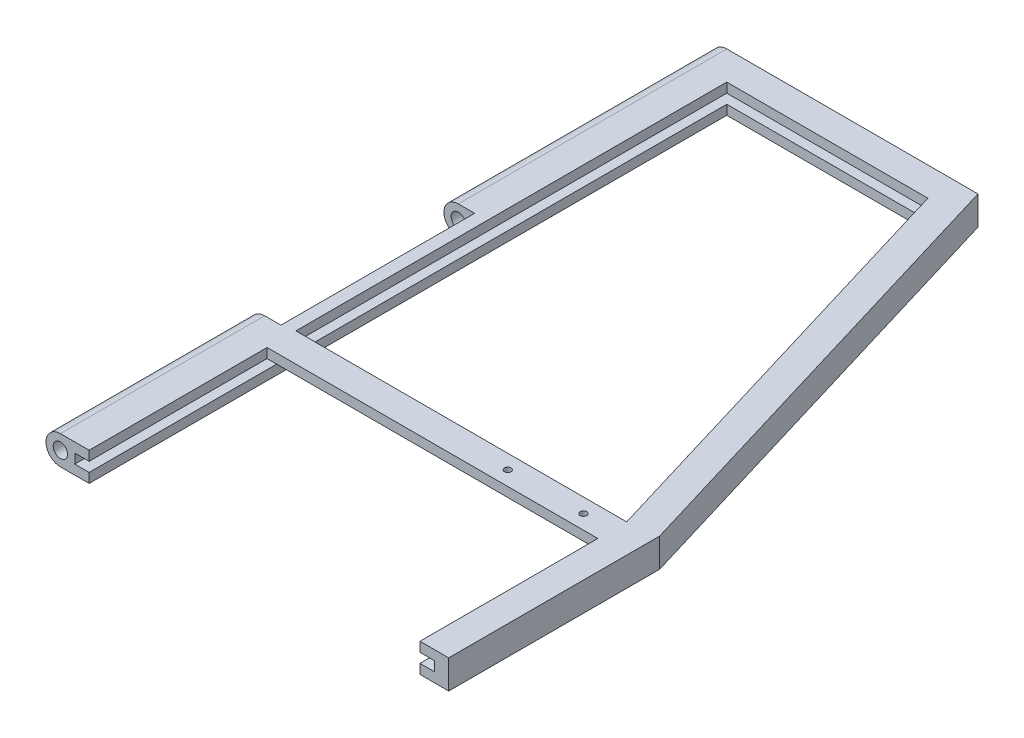
ISO-10303-21;
HEADER;
FILE_DESCRIPTION(('STEP AP214'),'2;1');
FILE_NAME('part.step','',(''),(''),'','','');
FILE_SCHEMA(('AUTOMOTIVE_DESIGN { 1 0 10303 214 1 1 1 1 }'));
ENDSEC;
DATA;
#1=APPLICATION_CONTEXT('core data for automotive mechanical design processes');
#2=APPLICATION_PROTOCOL_DEFINITION('international standard','automotive_design',2000,#1);
#3=PRODUCT_CONTEXT('',#1,'mechanical');
#4=PRODUCT('Part','Part','',(#3));
#5=PRODUCT_RELATED_PRODUCT_CATEGORY('part','',(#4));
#6=PRODUCT_DEFINITION_FORMATION('','',#4);
#7=PRODUCT_DEFINITION_CONTEXT('part definition',#1,'design');
#8=PRODUCT_DEFINITION('design','',#6,#7);
#9=PRODUCT_DEFINITION_SHAPE('','',#8);
#10=(LENGTH_UNIT() NAMED_UNIT(*) SI_UNIT(.MILLI.,.METRE.));
#11=(NAMED_UNIT(*) PLANE_ANGLE_UNIT() SI_UNIT($,.RADIAN.));
#12=(NAMED_UNIT(*) SI_UNIT($,.STERADIAN.) SOLID_ANGLE_UNIT());
#13=UNCERTAINTY_MEASURE_WITH_UNIT(LENGTH_MEASURE(1.E-05),#10,'distance_accuracy_value','');
#14=(GEOMETRIC_REPRESENTATION_CONTEXT(3) GLOBAL_UNCERTAINTY_ASSIGNED_CONTEXT((#13)) GLOBAL_UNIT_ASSIGNED_CONTEXT((#10,
#11,#12)) REPRESENTATION_CONTEXT('',''));
#15=CARTESIAN_POINT('',(0.,0.,0.));
#16=DIRECTION('',(0.,0.,1.));
#17=DIRECTION('',(1.,0.,0.));
#18=AXIS2_PLACEMENT_3D('',#15,#16,#17);
#19=CARTESIAN_POINT('',(0.,0.,3.));
#20=DIRECTION('',(0.,0.,1.));
#21=DIRECTION('',(1.,0.,0.));
#22=AXIS2_PLACEMENT_3D('',#19,#20,#21);
#23=PLANE('',#22);
#24=DIRECTION('',(-1.,0.,0.));
#25=VECTOR('',#24,1.);
#26=CARTESIAN_POINT('',(-0.199999999999998,1.99999999999999,3.));
#27=LINE('',#26,#25);
#28=CARTESIAN_POINT('',(22.2701570676023,1.99999999999999,3.));
#29=VERTEX_POINT('',#28);
#30=CARTESIAN_POINT('',(1.3,2.,3.));
#31=VERTEX_POINT('',#30);
#32=EDGE_CURVE('E289',#29,#31,#27,.T.);
#33=ORIENTED_EDGE('',*,*,#32,.F.);
#34=DIRECTION('',(0.,1.,0.));
#35=VECTOR('',#34,1.);
#36=CARTESIAN_POINT('',(22.2701570676023,0.,3.));
#37=LINE('',#36,#35);
#38=CARTESIAN_POINT('',(22.2701570676023,3.,3.));
#39=VERTEX_POINT('',#38);
#40=EDGE_CURVE('E421',#29,#39,#37,.T.);
#41=ORIENTED_EDGE('',*,*,#40,.T.);
#42=DIRECTION('',(1.,0.,0.));
#43=VECTOR('',#42,1.);
#44=CARTESIAN_POINT('',(0.,3.,3.));
#45=LINE('',#44,#43);
#46=CARTESIAN_POINT('',(1.3,3.,3.));
#47=VERTEX_POINT('',#46);
#48=EDGE_CURVE('E425',#47,#39,#45,.T.);
#49=ORIENTED_EDGE('',*,*,#48,.F.);
#50=DIRECTION('',(0.,1.,0.));
#51=VECTOR('',#50,1.);
#52=CARTESIAN_POINT('',(1.3,0.,3.));
#53=LINE('',#52,#51);
#54=EDGE_CURVE('E393',#31,#47,#53,.T.);
#55=ORIENTED_EDGE('',*,*,#54,.F.);
#56=EDGE_LOOP('',(#33,#41,#49,#55));
#57=FACE_BOUND('',#56,.T.);
#58=ADVANCED_FACE('F45',(#57),#23,.T.);
#59=CARTESIAN_POINT('',(1.3,0.,0.));
#60=DIRECTION('',(1.,0.,0.));
#61=DIRECTION('',(0.,0.,-1.));
#62=AXIS2_PLACEMENT_3D('',#59,#60,#61);
#63=PLANE('',#62);
#64=DIRECTION('',(0.,0.,-1.));
#65=VECTOR('',#64,1.);
#66=CARTESIAN_POINT('',(1.3,2.,0.));
#67=LINE('',#66,#65);
#68=CARTESIAN_POINT('',(1.3,1.99999999999999,69.5));
#69=VERTEX_POINT('',#68);
#70=CARTESIAN_POINT('',(1.3,1.99999999999999,50.9417859642579));
#71=VERTEX_POINT('',#70);
#72=EDGE_CURVE('E379',#69,#71,#67,.T.);
#73=ORIENTED_EDGE('',*,*,#72,.T.);
#74=DIRECTION('',(0.,-1.,0.));
#75=VECTOR('',#74,1.);
#76=CARTESIAN_POINT('',(1.3,3.,50.9417859642579));
#77=LINE('',#76,#75);
#78=CARTESIAN_POINT('',(1.3,3.,50.9417859642579));
#79=VERTEX_POINT('',#78);
#80=EDGE_CURVE('E307',#79,#71,#77,.T.);
#81=ORIENTED_EDGE('',*,*,#80,.F.);
#82=DIRECTION('',(0.,0.,-1.));
#83=VECTOR('',#82,1.);
#84=CARTESIAN_POINT('',(1.3,3.,0.));
#85=LINE('',#84,#83);
#86=CARTESIAN_POINT('',(1.3,3.,69.5));
#87=VERTEX_POINT('',#86);
#88=EDGE_CURVE('E397',#87,#79,#85,.T.);
#89=ORIENTED_EDGE('',*,*,#88,.F.);
#90=DIRECTION('',(0.,1.,0.));
#91=VECTOR('',#90,1.);
#92=CARTESIAN_POINT('',(1.3,0.,69.5));
#93=LINE('',#92,#91);
#94=EDGE_CURVE('E409',#69,#87,#93,.T.);
#95=ORIENTED_EDGE('',*,*,#94,.F.);
#96=EDGE_LOOP('',(#73,#81,#89,#95));
#97=FACE_BOUND('',#96,.T.);
#98=ADVANCED_FACE('F612',(#97),#63,.T.);
#99=CARTESIAN_POINT('',(1.3,3.,47.9417859642579));
#100=VERTEX_POINT('',#99);
#101=EDGE_CURVE('E70',#100,#47,#85,.T.);
#102=ORIENTED_EDGE('',*,*,#101,.F.);
#103=DIRECTION('',(0.,1.,0.));
#104=VECTOR('',#103,1.);
#105=CARTESIAN_POINT('',(1.3,3.,47.9417859642579));
#106=LINE('',#105,#104);
#107=CARTESIAN_POINT('',(1.3,1.99999999999999,47.9417859642579));
#108=VERTEX_POINT('',#107);
#109=EDGE_CURVE('E310',#108,#100,#106,.T.);
#110=ORIENTED_EDGE('',*,*,#109,.F.);
#111=EDGE_CURVE('E375',#108,#31,#67,.T.);
#112=ORIENTED_EDGE('',*,*,#111,.T.);
#113=ORIENTED_EDGE('',*,*,#54,.T.);
#114=EDGE_LOOP('',(#102,#110,#112,#113));
#115=FACE_BOUND('',#114,.T.);
#116=ADVANCED_FACE('F660',(#115),#63,.T.);
#117=CARTESIAN_POINT('',(35.8,0.,0.));
#118=DIRECTION('',(-1.,0.,0.));
#119=DIRECTION('',(0.,0.,1.));
#120=AXIS2_PLACEMENT_3D('',#117,#118,#119);
#121=PLANE('',#120);
#122=DIRECTION('',(0.,0.,1.));
#123=VECTOR('',#122,1.);
#124=CARTESIAN_POINT('',(35.8,3.,0.));
#125=LINE('',#124,#123);
#126=CARTESIAN_POINT('',(35.8,3.,50.9417859642579));
#127=VERTEX_POINT('',#126);
#128=CARTESIAN_POINT('',(35.8,3.,69.5));
#129=VERTEX_POINT('',#128);
#130=EDGE_CURVE('E62',#127,#129,#125,.T.);
#131=ORIENTED_EDGE('',*,*,#130,.F.);
#132=DIRECTION('',(0.,1.,0.));
#133=VECTOR('',#132,1.);
#134=CARTESIAN_POINT('',(35.8,3.,50.9417859642579));
#135=LINE('',#134,#133);
#136=CARTESIAN_POINT('',(35.8,1.99999999999999,50.9417859642579));
#137=VERTEX_POINT('',#136);
#138=EDGE_CURVE('E314',#137,#127,#135,.T.);
#139=ORIENTED_EDGE('',*,*,#138,.F.);
#140=DIRECTION('',(0.,0.,1.));
#141=VECTOR('',#140,1.);
#142=CARTESIAN_POINT('',(35.8,2.,0.));
#143=LINE('',#142,#141);
#144=CARTESIAN_POINT('',(35.8,1.99999999999999,69.5));
#145=VERTEX_POINT('',#144);
#146=EDGE_CURVE('E359',#137,#145,#143,.T.);
#147=ORIENTED_EDGE('',*,*,#146,.T.);
#148=DIRECTION('',(0.,1.,0.));
#149=VECTOR('',#148,1.);
#150=CARTESIAN_POINT('',(35.8,0.,69.5));
#151=LINE('',#150,#149);
#152=EDGE_CURVE('E413',#145,#129,#151,.T.);
#153=ORIENTED_EDGE('',*,*,#152,.T.);
#154=EDGE_LOOP('',(#131,#139,#147,#153));
#155=FACE_BOUND('',#154,.T.);
#156=ADVANCED_FACE('F604',(#155),#121,.T.);
#157=CARTESIAN_POINT('',(0.,0.,48.2));
#158=DIRECTION('',(0.,0.,-1.));
#159=DIRECTION('',(-1.,0.,0.));
#160=AXIS2_PLACEMENT_3D('',#157,#158,#159);
#161=PLANE('',#160);
#162=CARTESIAN_POINT('',(-1.7,1.5,48.2));
#163=DIRECTION('',(0.,0.,-1.));
#164=DIRECTION('',(-1.,0.,0.));
#165=AXIS2_PLACEMENT_3D('',#162,#163,#164);
#166=CIRCLE('',#165,0.75);
#167=CARTESIAN_POINT('',(-2.45,1.5,48.2));
#168=VERTEX_POINT('',#167);
#169=EDGE_CURVE('E471',#168,#168,#166,.F.);
#170=ORIENTED_EDGE('',*,*,#169,.T.);
#171=EDGE_LOOP('',(#170));
#172=FACE_BOUND('',#171,.T.);
#173=DIRECTION('',(0.,1.,0.));
#174=VECTOR('',#173,1.);
#175=CARTESIAN_POINT('',(0.,0.,48.2));
#176=LINE('',#175,#174);
#177=CARTESIAN_POINT('',(0.,1.99999999999999,48.2));
#178=VERTEX_POINT('',#177);
#179=CARTESIAN_POINT('',(0.,3.,48.2));
#180=VERTEX_POINT('',#179);
#181=EDGE_CURVE('E452',#178,#180,#176,.T.);
#182=ORIENTED_EDGE('',*,*,#181,.F.);
#183=DIRECTION('',(-1.,0.,0.));
#184=VECTOR('',#183,1.);
#185=CARTESIAN_POINT('',(0.,1.99999999999999,48.2));
#186=LINE('',#185,#184);
#187=CARTESIAN_POINT('',(-0.199999999999999,1.99999999999999,48.2));
#188=VERTEX_POINT('',#187);
#189=EDGE_CURVE('E361',#178,#188,#186,.T.);
#190=ORIENTED_EDGE('',*,*,#189,.T.);
#191=DIRECTION('',(0.,-1.,0.));
#192=VECTOR('',#191,1.);
#193=CARTESIAN_POINT('',(-0.199999999999999,0.,48.2));
#194=LINE('',#193,#192);
#195=CARTESIAN_POINT('',(-0.199999999999999,0.999999999999994,48.2));
#196=VERTEX_POINT('',#195);
#197=EDGE_CURVE('E364',#188,#196,#194,.T.);
#198=ORIENTED_EDGE('',*,*,#197,.T.);
#199=DIRECTION('',(-1.,0.,0.));
#200=VECTOR('',#199,1.);
#201=CARTESIAN_POINT('',(0.,0.999999999999994,48.2));
#202=LINE('',#201,#200);
#203=CARTESIAN_POINT('',(0.,0.999999999999994,48.2));
#204=VERTEX_POINT('',#203);
#205=EDGE_CURVE('E357',#204,#196,#202,.T.);
#206=ORIENTED_EDGE('',*,*,#205,.F.);
#207=CARTESIAN_POINT('',(0.,0.,48.2));
#208=VERTEX_POINT('',#207);
#209=EDGE_CURVE('E461',#208,#204,#176,.T.);
#210=ORIENTED_EDGE('',*,*,#209,.F.);
#211=DIRECTION('',(-1.,0.,0.));
#212=VECTOR('',#211,1.);
#213=CARTESIAN_POINT('',(0.,0.,48.2));
#214=LINE('',#213,#212);
#215=CARTESIAN_POINT('',(-1.7,0.,48.2));
#216=VERTEX_POINT('',#215);
#217=EDGE_CURVE('E442',#208,#216,#214,.T.);
#218=ORIENTED_EDGE('',*,*,#217,.T.);
#219=CARTESIAN_POINT('',(-1.7,1.5,48.2));
#220=DIRECTION('',(0.,0.,-1.));
#221=DIRECTION('',(-1.,0.,0.));
#222=AXIS2_PLACEMENT_3D('',#219,#220,#221);
#223=CIRCLE('',#222,1.5);
#224=CARTESIAN_POINT('',(-1.7,3.,48.2));
#225=VERTEX_POINT('',#224);
#226=EDGE_CURVE('E472',#225,#216,#223,.F.);
#227=ORIENTED_EDGE('',*,*,#226,.F.);
#228=DIRECTION('',(-1.,0.,0.));
#229=VECTOR('',#228,1.);
#230=CARTESIAN_POINT('',(0.,3.,48.2));
#231=LINE('',#230,#229);
#232=EDGE_CURVE('E453',#180,#225,#231,.T.);
#233=ORIENTED_EDGE('',*,*,#232,.F.);
#234=EDGE_LOOP('',(#182,#190,#198,#206,#210,#218,#227,#233));
#235=FACE_BOUND('',#234,.T.);
#236=ADVANCED_FACE('F547',(#172,#235),#161,.T.);
#237=CARTESIAN_POINT('',(0.,0.,48.2));
#238=DIRECTION('',(1.,0.,0.));
#239=DIRECTION('',(0.,0.,-1.));
#240=AXIS2_PLACEMENT_3D('',#237,#238,#239);
#241=PLANE('',#240);
#242=DIRECTION('',(0.,0.,-1.));
#243=VECTOR('',#242,1.);
#244=CARTESIAN_POINT('',(0.,1.99999999999999,48.2));
#245=LINE('',#244,#243);
#246=CARTESIAN_POINT('',(0.,2.,28.));
#247=VERTEX_POINT('',#246);
#248=EDGE_CURVE('E381',#178,#247,#245,.T.);
#249=ORIENTED_EDGE('',*,*,#248,.F.);
#250=ORIENTED_EDGE('',*,*,#181,.T.);
#251=DIRECTION('',(0.,0.,-1.));
#252=VECTOR('',#251,1.);
#253=CARTESIAN_POINT('',(0.,3.,48.2));
#254=LINE('',#253,#252);
#255=CARTESIAN_POINT('',(0.,3.,28.));
#256=VERTEX_POINT('',#255);
#257=EDGE_CURVE('E446',#180,#256,#254,.T.);
#258=ORIENTED_EDGE('',*,*,#257,.T.);
#259=DIRECTION('',(0.,1.,0.));
#260=VECTOR('',#259,1.);
#261=CARTESIAN_POINT('',(0.,0.,28.));
#262=LINE('',#261,#260);
#263=EDGE_CURVE('E464',#247,#256,#262,.T.);
#264=ORIENTED_EDGE('',*,*,#263,.F.);
#265=EDGE_LOOP('',(#249,#250,#258,#264));
#266=FACE_BOUND('',#265,.T.);
#267=ADVANCED_FACE('F627',(#266),#241,.F.);
#268=CARTESIAN_POINT('',(38.8,0.,69.5));
#269=DIRECTION('',(0.,0.,-1.));
#270=DIRECTION('',(-1.,0.,0.));
#271=AXIS2_PLACEMENT_3D('',#268,#269,#270);
#272=PLANE('',#271);
#273=CARTESIAN_POINT('',(-1.7,1.5,69.5));
#274=DIRECTION('',(0.,0.,-1.));
#275=DIRECTION('',(-1.,0.,0.));
#276=AXIS2_PLACEMENT_3D('',#273,#274,#275);
#277=CIRCLE('',#276,0.75);
#278=CARTESIAN_POINT('',(-2.45,1.5,69.5));
#279=VERTEX_POINT('',#278);
#280=EDGE_CURVE('E474',#279,#279,#277,.F.);
#281=ORIENTED_EDGE('',*,*,#280,.F.);
#282=EDGE_LOOP('',(#281));
#283=FACE_BOUND('',#282,.T.);
#284=DIRECTION('',(-1.,0.,0.));
#285=VECTOR('',#284,1.);
#286=CARTESIAN_POINT('',(60.8227155455453,1.99999999999999,69.5));
#287=LINE('',#286,#285);
#288=CARTESIAN_POINT('',(-0.199999999999998,1.99999999999999,69.5));
#289=VERTEX_POINT('',#288);
#290=EDGE_CURVE('E349',#69,#289,#287,.T.);
#291=ORIENTED_EDGE('',*,*,#290,.F.);
#292=ORIENTED_EDGE('',*,*,#94,.T.);
#293=DIRECTION('',(-1.,0.,0.));
#294=VECTOR('',#293,1.);
#295=CARTESIAN_POINT('',(38.8,3.,69.5));
#296=LINE('',#295,#294);
#297=CARTESIAN_POINT('',(-1.7,3.,69.5));
#298=VERTEX_POINT('',#297);
#299=EDGE_CURVE('E401',#87,#298,#296,.T.);
#300=ORIENTED_EDGE('',*,*,#299,.T.);
#301=CARTESIAN_POINT('',(-1.7,1.5,69.5));
#302=DIRECTION('',(0.,0.,-1.));
#303=DIRECTION('',(-1.,0.,0.));
#304=AXIS2_PLACEMENT_3D('',#301,#302,#303);
#305=CIRCLE('',#304,1.5);
#306=CARTESIAN_POINT('',(-1.7,0.,69.5));
#307=VERTEX_POINT('',#306);
#308=EDGE_CURVE('E475',#298,#307,#305,.F.);
#309=ORIENTED_EDGE('',*,*,#308,.T.);
#310=DIRECTION('',(-1.,0.,0.));
#311=VECTOR('',#310,1.);
#312=CARTESIAN_POINT('',(38.8,0.,69.5));
#313=LINE('',#312,#311);
#314=CARTESIAN_POINT('',(1.3,0.,69.5));
#315=VERTEX_POINT('',#314);
#316=EDGE_CURVE('E402',#315,#307,#313,.T.);
#317=ORIENTED_EDGE('',*,*,#316,.F.);
#318=CARTESIAN_POINT('',(1.3,0.999999999999995,69.5));
#319=VERTEX_POINT('',#318);
#320=EDGE_CURVE('E405',#315,#319,#93,.T.);
#321=ORIENTED_EDGE('',*,*,#320,.T.);
#322=DIRECTION('',(-1.,0.,0.));
#323=VECTOR('',#322,1.);
#324=CARTESIAN_POINT('',(60.8227155455453,0.999999999999995,69.5));
#325=LINE('',#324,#323);
#326=CARTESIAN_POINT('',(-0.199999999999998,0.999999999999995,69.5));
#327=VERTEX_POINT('',#326);
#328=EDGE_CURVE('E345',#319,#327,#325,.T.);
#329=ORIENTED_EDGE('',*,*,#328,.T.);
#330=DIRECTION('',(0.,-1.,0.));
#331=VECTOR('',#330,1.);
#332=CARTESIAN_POINT('',(-0.199999999999998,0.,69.5));
#333=LINE('',#332,#331);
#334=EDGE_CURVE('E338',#289,#327,#333,.T.);
#335=ORIENTED_EDGE('',*,*,#334,.F.);
#336=EDGE_LOOP('',(#291,#292,#300,#309,#317,#321,#329,#335));
#337=FACE_BOUND('',#336,.T.);
#338=ADVANCED_FACE('F558',(#283,#337),#272,.F.);
#339=CARTESIAN_POINT('',(19.5913797816014,0.,-5.89803643951368));
#340=DIRECTION('',(-0.957548422591337,0.,0.288272472485392));
#341=DIRECTION('',(0.288272472485393,0.,0.957548422591338));
#342=AXIS2_PLACEMENT_3D('',#339,#340,#341);
#343=PLANE('',#342);
#344=DIRECTION('',(0.288272472485393,0.,0.957548422591338));
#345=VECTOR('',#344,1.);
#346=CARTESIAN_POINT('',(19.5913797816014,2.,-5.89803643951368));
#347=LINE('',#346,#345);
#348=CARTESIAN_POINT('',(35.8,1.99999999999999,47.9417859642579));
#349=VERTEX_POINT('',#348);
#350=EDGE_CURVE('E509',#29,#349,#347,.T.);
#351=ORIENTED_EDGE('',*,*,#350,.T.);
#352=DIRECTION('',(0.,1.,0.));
#353=VECTOR('',#352,1.);
#354=CARTESIAN_POINT('',(35.8,0.,47.9417859642579));
#355=LINE('',#354,#353);
#356=CARTESIAN_POINT('',(35.8,3.,47.9417859642579));
#357=VERTEX_POINT('',#356);
#358=EDGE_CURVE('E417',#349,#357,#355,.T.);
#359=ORIENTED_EDGE('',*,*,#358,.T.);
#360=DIRECTION('',(0.288272472485393,0.,0.957548422591338));
#361=VECTOR('',#360,1.);
#362=CARTESIAN_POINT('',(19.5913797816014,3.,-5.89803643951368));
#363=LINE('',#362,#361);
#364=EDGE_CURVE('E428',#39,#357,#363,.T.);
#365=ORIENTED_EDGE('',*,*,#364,.F.);
#366=ORIENTED_EDGE('',*,*,#40,.F.);
#367=EDGE_LOOP('',(#351,#359,#365,#366));
#368=FACE_BOUND('',#367,.T.);
#369=ADVANCED_FACE('F669',(#368),#343,.T.);
#370=CARTESIAN_POINT('',(37.3,1.99999999999999,69.5));
#371=VERTEX_POINT('',#370);
#372=EDGE_CURVE('E350',#371,#145,#287,.T.);
#373=ORIENTED_EDGE('',*,*,#372,.F.);
#374=DIRECTION('',(0.,1.,0.));
#375=VECTOR('',#374,1.);
#376=CARTESIAN_POINT('',(37.3,0.,69.5));
#377=LINE('',#376,#375);
#378=CARTESIAN_POINT('',(37.3,0.999999999999995,69.5));
#379=VERTEX_POINT('',#378);
#380=EDGE_CURVE('E327',#379,#371,#377,.T.);
#381=ORIENTED_EDGE('',*,*,#380,.F.);
#382=CARTESIAN_POINT('',(35.8,0.999999999999995,69.5));
#383=VERTEX_POINT('',#382);
#384=EDGE_CURVE('E346',#379,#383,#325,.T.);
#385=ORIENTED_EDGE('',*,*,#384,.T.);
#386=CARTESIAN_POINT('',(35.8,0.,69.5));
#387=VERTEX_POINT('',#386);
#388=EDGE_CURVE('E410',#387,#383,#151,.T.);
#389=ORIENTED_EDGE('',*,*,#388,.F.);
#390=CARTESIAN_POINT('',(38.8,0.,69.5));
#391=VERTEX_POINT('',#390);
#392=EDGE_CURVE('E396',#391,#387,#313,.T.);
#393=ORIENTED_EDGE('',*,*,#392,.F.);
#394=DIRECTION('',(0.,1.,0.));
#395=VECTOR('',#394,1.);
#396=CARTESIAN_POINT('',(38.8,0.,69.5));
#397=LINE('',#396,#395);
#398=CARTESIAN_POINT('',(38.8,3.,69.5));
#399=VERTEX_POINT('',#398);
#400=EDGE_CURVE('E394',#391,#399,#397,.T.);
#401=ORIENTED_EDGE('',*,*,#400,.T.);
#402=EDGE_CURVE('E398',#399,#129,#296,.T.);
#403=ORIENTED_EDGE('',*,*,#402,.T.);
#404=ORIENTED_EDGE('',*,*,#152,.F.);
#405=EDGE_LOOP('',(#373,#381,#385,#389,#393,#401,#403,#404));
#406=FACE_BOUND('',#405,.T.);
#407=ADVANCED_FACE('F585',(#406),#272,.F.);
#408=CARTESIAN_POINT('',(0.,3.,0.));
#409=DIRECTION('',(0.,1.,0.));
#410=DIRECTION('',(0.,0.,1.));
#411=AXIS2_PLACEMENT_3D('',#408,#409,#410);
#412=PLANE('',#411);
#413=CARTESIAN_POINT('',(32.8,3.,49.4417859642579));
#414=DIRECTION('',(0.,1.,0.));
#415=DIRECTION('',(0.,0.,1.));
#416=AXIS2_PLACEMENT_3D('',#413,#414,#415);
#417=CIRCLE('',#416,0.350000000000002);
#418=CARTESIAN_POINT('',(32.8,3.,49.7917859642579));
#419=VERTEX_POINT('',#418);
#420=EDGE_CURVE('E301',#419,#419,#417,.T.);
#421=ORIENTED_EDGE('',*,*,#420,.F.);
#422=EDGE_LOOP('',(#421));
#423=FACE_BOUND('',#422,.T.);
#424=CARTESIAN_POINT('',(24.9,3.,49.4417859642579));
#425=DIRECTION('',(0.,1.,0.));
#426=DIRECTION('',(0.,0.,1.));
#427=AXIS2_PLACEMENT_3D('',#424,#425,#426);
#428=CIRCLE('',#427,0.350000000000008);
#429=CARTESIAN_POINT('',(24.9,3.,49.7917859642579));
#430=VERTEX_POINT('',#429);
#431=EDGE_CURVE('E299',#430,#430,#428,.T.);
#432=ORIENTED_EDGE('',*,*,#431,.F.);
#433=EDGE_LOOP('',(#432));
#434=FACE_BOUND('',#433,.T.);
#435=DIRECTION('',(1.,0.,0.));
#436=VECTOR('',#435,1.);
#437=CARTESIAN_POINT('',(-1.86227766016838,3.,50.9417859642579));
#438=LINE('',#437,#436);
#439=EDGE_CURVE('E320',#79,#127,#438,.T.);
#440=ORIENTED_EDGE('',*,*,#439,.T.);
#441=ORIENTED_EDGE('',*,*,#130,.T.);
#442=ORIENTED_EDGE('',*,*,#402,.F.);
#443=DIRECTION('',(0.,0.,-1.));
#444=VECTOR('',#443,1.);
#445=CARTESIAN_POINT('',(38.8,3.,73.));
#446=LINE('',#445,#444);
#447=CARTESIAN_POINT('',(38.8,3.,47.5));
#448=VERTEX_POINT('',#447);
#449=EDGE_CURVE('E492',#399,#448,#446,.T.);
#450=ORIENTED_EDGE('',*,*,#449,.T.);
#451=DIRECTION('',(-0.288272472485392,0.,-0.957548422591338));
#452=VECTOR('',#451,1.);
#453=CARTESIAN_POINT('',(38.8,3.,47.5));
#454=LINE('',#453,#452);
#455=CARTESIAN_POINT('',(24.5,3.,0.));
#456=VERTEX_POINT('',#455);
#457=EDGE_CURVE('E495',#448,#456,#454,.T.);
#458=ORIENTED_EDGE('',*,*,#457,.T.);
#459=DIRECTION('',(-1.,0.,0.));
#460=VECTOR('',#459,1.);
#461=CARTESIAN_POINT('',(24.5,3.,0.));
#462=LINE('',#461,#460);
#463=CARTESIAN_POINT('',(-1.7,3.,0.));
#464=VERTEX_POINT('',#463);
#465=EDGE_CURVE('E489',#456,#464,#462,.T.);
#466=ORIENTED_EDGE('',*,*,#465,.T.);
#467=DIRECTION('',(0.,0.,-1.));
#468=VECTOR('',#467,1.);
#469=CARTESIAN_POINT('',(-1.7,3.,77.3863424398923));
#470=LINE('',#469,#468);
#471=CARTESIAN_POINT('',(-1.7,3.,28.));
#472=VERTEX_POINT('',#471);
#473=EDGE_CURVE('E484',#472,#464,#470,.T.);
#474=ORIENTED_EDGE('',*,*,#473,.F.);
#475=DIRECTION('',(-1.,0.,0.));
#476=VECTOR('',#475,1.);
#477=CARTESIAN_POINT('',(0.,3.,28.));
#478=LINE('',#477,#476);
#479=EDGE_CURVE('E456',#256,#472,#478,.T.);
#480=ORIENTED_EDGE('',*,*,#479,.F.);
#481=ORIENTED_EDGE('',*,*,#257,.F.);
#482=ORIENTED_EDGE('',*,*,#232,.T.);
#483=EDGE_CURVE('E486',#298,#225,#470,.T.);
#484=ORIENTED_EDGE('',*,*,#483,.F.);
#485=ORIENTED_EDGE('',*,*,#299,.F.);
#486=ORIENTED_EDGE('',*,*,#88,.T.);
#487=EDGE_LOOP('',(#440,#441,#442,#450,#458,#466,#474,#480,#481,#482,#484,#485,#486));
#488=FACE_BOUND('',#487,.T.);
#489=ORIENTED_EDGE('',*,*,#364,.T.);
#490=DIRECTION('',(1.,0.,0.));
#491=VECTOR('',#490,1.);
#492=CARTESIAN_POINT('',(-1.86227766016838,3.,47.9417859642579));
#493=LINE('',#492,#491);
#494=EDGE_CURVE('E317',#100,#357,#493,.T.);
#495=ORIENTED_EDGE('',*,*,#494,.F.);
#496=ORIENTED_EDGE('',*,*,#101,.T.);
#497=ORIENTED_EDGE('',*,*,#48,.T.);
#498=EDGE_LOOP('',(#489,#495,#496,#497));
#499=FACE_BOUND('',#498,.T.);
#500=ADVANCED_FACE('F616',(#423,#434,#488,#499),#412,.T.);
#501=CARTESIAN_POINT('',(0.,0.,0.));
#502=DIRECTION('',(0.,1.,0.));
#503=DIRECTION('',(0.,0.,1.));
#504=AXIS2_PLACEMENT_3D('',#501,#502,#503);
#505=PLANE('',#504);
#506=DIRECTION('',(0.,0.,-1.));
#507=VECTOR('',#506,1.);
#508=CARTESIAN_POINT('',(38.8,0.,73.));
#509=LINE('',#508,#507);
#510=CARTESIAN_POINT('',(38.8,0.,47.5));
#511=VERTEX_POINT('',#510);
#512=EDGE_CURVE('E501',#391,#511,#509,.T.);
#513=ORIENTED_EDGE('',*,*,#512,.F.);
#514=ORIENTED_EDGE('',*,*,#392,.T.);
#515=DIRECTION('',(0.,0.,1.));
#516=VECTOR('',#515,1.);
#517=CARTESIAN_POINT('',(35.8,0.,0.));
#518=LINE('',#517,#516);
#519=CARTESIAN_POINT('',(35.8,0.,47.9417859642579));
#520=VERTEX_POINT('',#519);
#521=EDGE_CURVE('E438',#520,#387,#518,.T.);
#522=ORIENTED_EDGE('',*,*,#521,.F.);
#523=DIRECTION('',(0.288272472485393,0.,0.957548422591338));
#524=VECTOR('',#523,1.);
#525=CARTESIAN_POINT('',(19.5913797816014,0.,-5.89803643951368));
#526=LINE('',#525,#524);
#527=CARTESIAN_POINT('',(22.2701570676023,0.,3.));
#528=VERTEX_POINT('',#527);
#529=EDGE_CURVE('E436',#528,#520,#526,.T.);
#530=ORIENTED_EDGE('',*,*,#529,.F.);
#531=DIRECTION('',(1.,0.,0.));
#532=VECTOR('',#531,1.);
#533=CARTESIAN_POINT('',(0.,0.,3.));
#534=LINE('',#533,#532);
#535=CARTESIAN_POINT('',(1.3,0.,3.));
#536=VERTEX_POINT('',#535);
#537=EDGE_CURVE('E408',#536,#528,#534,.T.);
#538=ORIENTED_EDGE('',*,*,#537,.F.);
#539=DIRECTION('',(0.,0.,-1.));
#540=VECTOR('',#539,1.);
#541=CARTESIAN_POINT('',(1.3,0.,0.));
#542=LINE('',#541,#540);
#543=EDGE_CURVE('E429',#315,#536,#542,.T.);
#544=ORIENTED_EDGE('',*,*,#543,.F.);
#545=ORIENTED_EDGE('',*,*,#316,.T.);
#546=DIRECTION('',(0.,0.,-1.));
#547=VECTOR('',#546,1.);
#548=CARTESIAN_POINT('',(-1.7,0.,77.3863424398923));
#549=LINE('',#548,#547);
#550=EDGE_CURVE('E487',#307,#216,#549,.T.);
#551=ORIENTED_EDGE('',*,*,#550,.T.);
#552=ORIENTED_EDGE('',*,*,#217,.F.);
#553=DIRECTION('',(0.,0.,-1.));
#554=VECTOR('',#553,1.);
#555=CARTESIAN_POINT('',(0.,0.,48.2));
#556=LINE('',#555,#554);
#557=CARTESIAN_POINT('',(0.,0.,28.));
#558=VERTEX_POINT('',#557);
#559=EDGE_CURVE('E449',#208,#558,#556,.T.);
#560=ORIENTED_EDGE('',*,*,#559,.T.);
#561=DIRECTION('',(-1.,0.,0.));
#562=VECTOR('',#561,1.);
#563=CARTESIAN_POINT('',(0.,0.,28.));
#564=LINE('',#563,#562);
#565=CARTESIAN_POINT('',(-1.7,0.,28.));
#566=VERTEX_POINT('',#565);
#567=EDGE_CURVE('E445',#558,#566,#564,.T.);
#568=ORIENTED_EDGE('',*,*,#567,.T.);
#569=CARTESIAN_POINT('',(-1.7,0.,0.));
#570=VERTEX_POINT('',#569);
#571=EDGE_CURVE('E483',#566,#570,#549,.T.);
#572=ORIENTED_EDGE('',*,*,#571,.T.);
#573=DIRECTION('',(-1.,0.,0.));
#574=VECTOR('',#573,1.);
#575=CARTESIAN_POINT('',(24.5,0.,0.));
#576=LINE('',#575,#574);
#577=CARTESIAN_POINT('',(24.5,0.,0.));
#578=VERTEX_POINT('',#577);
#579=EDGE_CURVE('E498',#578,#570,#576,.T.);
#580=ORIENTED_EDGE('',*,*,#579,.F.);
#581=DIRECTION('',(-0.288272472485392,0.,-0.957548422591338));
#582=VECTOR('',#581,1.);
#583=CARTESIAN_POINT('',(38.8,0.,47.5));
#584=LINE('',#583,#582);
#585=EDGE_CURVE('E493',#511,#578,#584,.T.);
#586=ORIENTED_EDGE('',*,*,#585,.F.);
#587=EDGE_LOOP('',(#513,#514,#522,#530,#538,#544,#545,#551,#552,#560,#568,#572,#580,#586));
#588=FACE_BOUND('',#587,.T.);
#589=ADVANCED_FACE('F572',(#588),#505,.F.);
#590=CARTESIAN_POINT('',(-1.7,1.5,77.3863424398923));
#591=DIRECTION('',(0.,0.,-1.));
#592=DIRECTION('',(-1.,0.,0.));
#593=AXIS2_PLACEMENT_3D('',#590,#591,#592);
#594=CYLINDRICAL_SURFACE('',#593,1.5);
#595=ORIENTED_EDGE('',*,*,#308,.F.);
#596=ORIENTED_EDGE('',*,*,#483,.T.);
#597=ORIENTED_EDGE('',*,*,#226,.T.);
#598=ORIENTED_EDGE('',*,*,#550,.F.);
#599=EDGE_LOOP('',(#595,#596,#597,#598));
#600=FACE_BOUND('',#599,.T.);
#601=ADVANCED_FACE('F621',(#600),#594,.T.);
#602=CARTESIAN_POINT('',(24.5,3.,0.));
#603=DIRECTION('',(0.,0.,1.));
#604=DIRECTION('',(1.,0.,0.));
#605=AXIS2_PLACEMENT_3D('',#602,#603,#604);
#606=PLANE('',#605);
#607=ORIENTED_EDGE('',*,*,#579,.T.);
#608=CARTESIAN_POINT('',(-1.7,1.5,0.));
#609=DIRECTION('',(0.,0.,-1.));
#610=DIRECTION('',(-1.,0.,0.));
#611=AXIS2_PLACEMENT_3D('',#608,#609,#610);
#612=CIRCLE('',#611,1.5);
#613=EDGE_CURVE('E477',#570,#464,#612,.T.);
#614=ORIENTED_EDGE('',*,*,#613,.T.);
#615=ORIENTED_EDGE('',*,*,#465,.F.);
#616=DIRECTION('',(0.,-1.,0.));
#617=VECTOR('',#616,1.);
#618=CARTESIAN_POINT('',(24.5,3.,0.));
#619=LINE('',#618,#617);
#620=EDGE_CURVE('E497',#456,#578,#619,.T.);
#621=ORIENTED_EDGE('',*,*,#620,.T.);
#622=EDGE_LOOP('',(#607,#614,#615,#621));
#623=FACE_BOUND('',#622,.T.);
#624=CARTESIAN_POINT('',(-1.7,1.5,0.));
#625=DIRECTION('',(0.,0.,-1.));
#626=DIRECTION('',(-1.,0.,0.));
#627=AXIS2_PLACEMENT_3D('',#624,#625,#626);
#628=CIRCLE('',#627,0.75);
#629=CARTESIAN_POINT('',(-2.45,1.5,0.));
#630=VERTEX_POINT('',#629);
#631=EDGE_CURVE('E480',#630,#630,#628,.T.);
#632=ORIENTED_EDGE('',*,*,#631,.F.);
#633=EDGE_LOOP('',(#632));
#634=FACE_BOUND('',#633,.T.);
#635=ADVANCED_FACE('F47',(#623,#634),#606,.F.);
#636=CARTESIAN_POINT('',(38.8,3.,73.));
#637=DIRECTION('',(-1.,0.,0.));
#638=DIRECTION('',(0.,0.,1.));
#639=AXIS2_PLACEMENT_3D('',#636,#637,#638);
#640=PLANE('',#639);
#641=ORIENTED_EDGE('',*,*,#449,.F.);
#642=ORIENTED_EDGE('',*,*,#400,.F.);
#643=ORIENTED_EDGE('',*,*,#512,.T.);
#644=DIRECTION('',(0.,-1.,0.));
#645=VECTOR('',#644,1.);
#646=CARTESIAN_POINT('',(38.8,3.,47.5));
#647=LINE('',#646,#645);
#648=EDGE_CURVE('E506',#448,#511,#647,.T.);
#649=ORIENTED_EDGE('',*,*,#648,.F.);
#650=EDGE_LOOP('',(#641,#642,#643,#649));
#651=FACE_BOUND('',#650,.T.);
#652=ADVANCED_FACE('F645',(#651),#640,.F.);
#653=CARTESIAN_POINT('',(38.8,3.,47.5));
#654=DIRECTION('',(-0.957548422591337,0.,0.288272472485392));
#655=DIRECTION('',(0.288272472485392,0.,0.957548422591338));
#656=AXIS2_PLACEMENT_3D('',#653,#654,#655);
#657=PLANE('',#656);
#658=ORIENTED_EDGE('',*,*,#585,.T.);
#659=ORIENTED_EDGE('',*,*,#620,.F.);
#660=ORIENTED_EDGE('',*,*,#457,.F.);
#661=ORIENTED_EDGE('',*,*,#648,.T.);
#662=EDGE_LOOP('',(#658,#659,#660,#661));
#663=FACE_BOUND('',#662,.T.);
#664=ADVANCED_FACE('F640',(#663),#657,.F.);
#665=CARTESIAN_POINT('',(-1.7,1.5,28.));
#666=DIRECTION('',(0.,0.,-1.));
#667=DIRECTION('',(-1.,0.,0.));
#668=AXIS2_PLACEMENT_3D('',#665,#666,#667);
#669=CIRCLE('',#668,1.5);
#670=EDGE_CURVE('E469',#472,#566,#669,.F.);
#671=ORIENTED_EDGE('',*,*,#670,.F.);
#672=ORIENTED_EDGE('',*,*,#473,.T.);
#673=ORIENTED_EDGE('',*,*,#613,.F.);
#674=ORIENTED_EDGE('',*,*,#571,.F.);
#675=EDGE_LOOP('',(#671,#672,#673,#674));
#676=FACE_BOUND('',#675,.T.);
#677=ADVANCED_FACE('F631',(#676),#594,.T.);
#678=CARTESIAN_POINT('',(-1.7,1.5,77.3863424398923));
#679=DIRECTION('',(0.,0.,-1.));
#680=DIRECTION('',(-1.,0.,0.));
#681=AXIS2_PLACEMENT_3D('',#678,#679,#680);
#682=CYLINDRICAL_SURFACE('',#681,0.75);
#683=CARTESIAN_POINT('',(-1.7,1.5,28.));
#684=DIRECTION('',(0.,0.,-1.));
#685=DIRECTION('',(-1.,0.,0.));
#686=AXIS2_PLACEMENT_3D('',#683,#684,#685);
#687=CIRCLE('',#686,0.75);
#688=CARTESIAN_POINT('',(-2.45,1.5,28.));
#689=VERTEX_POINT('',#688);
#690=EDGE_CURVE('E468',#689,#689,#687,.F.);
#691=ORIENTED_EDGE('',*,*,#690,.T.);
#692=EDGE_LOOP('',(#691));
#693=FACE_BOUND('',#692,.T.);
#694=ORIENTED_EDGE('',*,*,#631,.T.);
#695=EDGE_LOOP('',(#694));
#696=FACE_BOUND('',#695,.T.);
#697=ADVANCED_FACE('F677',(#693,#696),#682,.F.);
#698=CARTESIAN_POINT('',(0.,0.,28.));
#699=DIRECTION('',(0.,0.,-1.));
#700=DIRECTION('',(-1.,0.,0.));
#701=AXIS2_PLACEMENT_3D('',#698,#699,#700);
#702=PLANE('',#701);
#703=CARTESIAN_POINT('',(0.,0.999999999999996,28.));
#704=VERTEX_POINT('',#703);
#705=EDGE_CURVE('E465',#558,#704,#262,.T.);
#706=ORIENTED_EDGE('',*,*,#705,.T.);
#707=DIRECTION('',(-1.,0.,0.));
#708=VECTOR('',#707,1.);
#709=CARTESIAN_POINT('',(0.,0.999999999999996,28.));
#710=LINE('',#709,#708);
#711=CARTESIAN_POINT('',(-0.199999999999999,0.999999999999996,28.));
#712=VERTEX_POINT('',#711);
#713=EDGE_CURVE('E391',#704,#712,#710,.T.);
#714=ORIENTED_EDGE('',*,*,#713,.T.);
#715=DIRECTION('',(0.,-1.,0.));
#716=VECTOR('',#715,1.);
#717=CARTESIAN_POINT('',(-0.199999999999999,0.,28.));
#718=LINE('',#717,#716);
#719=CARTESIAN_POINT('',(-0.199999999999999,2.,28.));
#720=VERTEX_POINT('',#719);
#721=EDGE_CURVE('E14',#720,#712,#718,.T.);
#722=ORIENTED_EDGE('',*,*,#721,.F.);
#723=DIRECTION('',(-1.,0.,0.));
#724=VECTOR('',#723,1.);
#725=CARTESIAN_POINT('',(0.,2.,28.));
#726=LINE('',#725,#724);
#727=EDGE_CURVE('E383',#247,#720,#726,.T.);
#728=ORIENTED_EDGE('',*,*,#727,.F.);
#729=ORIENTED_EDGE('',*,*,#263,.T.);
#730=ORIENTED_EDGE('',*,*,#479,.T.);
#731=ORIENTED_EDGE('',*,*,#670,.T.);
#732=ORIENTED_EDGE('',*,*,#567,.F.);
#733=EDGE_LOOP('',(#706,#714,#722,#728,#729,#730,#731,#732));
#734=FACE_BOUND('',#733,.T.);
#735=ORIENTED_EDGE('',*,*,#690,.F.);
#736=EDGE_LOOP('',(#735));
#737=FACE_BOUND('',#736,.T.);
#738=ADVANCED_FACE('F537',(#734,#737),#702,.F.);
#739=ORIENTED_EDGE('',*,*,#209,.T.);
#740=DIRECTION('',(0.,0.,-1.));
#741=VECTOR('',#740,1.);
#742=CARTESIAN_POINT('',(0.,0.999999999999994,48.2));
#743=LINE('',#742,#741);
#744=EDGE_CURVE('E388',#204,#704,#743,.T.);
#745=ORIENTED_EDGE('',*,*,#744,.T.);
#746=ORIENTED_EDGE('',*,*,#705,.F.);
#747=ORIENTED_EDGE('',*,*,#559,.F.);
#748=EDGE_LOOP('',(#739,#745,#746,#747));
#749=FACE_BOUND('',#748,.T.);
#750=ADVANCED_FACE('F542',(#749),#241,.F.);
#751=ORIENTED_EDGE('',*,*,#280,.T.);
#752=EDGE_LOOP('',(#751));
#753=FACE_BOUND('',#752,.T.);
#754=ORIENTED_EDGE('',*,*,#169,.F.);
#755=EDGE_LOOP('',(#754));
#756=FACE_BOUND('',#755,.T.);
#757=ADVANCED_FACE('F670',(#753,#756),#682,.F.);
#758=DIRECTION('',(0.,0.,-1.));
#759=VECTOR('',#758,1.);
#760=CARTESIAN_POINT('',(1.3,1.,0.));
#761=LINE('',#760,#759);
#762=CARTESIAN_POINT('',(1.3,0.999999999999995,3.));
#763=VERTEX_POINT('',#762);
#764=EDGE_CURVE('E385',#319,#763,#761,.T.);
#765=ORIENTED_EDGE('',*,*,#764,.F.);
#766=ORIENTED_EDGE('',*,*,#320,.F.);
#767=ORIENTED_EDGE('',*,*,#543,.T.);
#768=EDGE_CURVE('E422',#536,#763,#53,.T.);
#769=ORIENTED_EDGE('',*,*,#768,.T.);
#770=EDGE_LOOP('',(#765,#766,#767,#769));
#771=FACE_BOUND('',#770,.T.);
#772=ADVANCED_FACE('F563',(#771),#63,.T.);
#773=DIRECTION('',(1.,0.,0.));
#774=VECTOR('',#773,1.);
#775=CARTESIAN_POINT('',(-0.199999999999998,0.999999999999995,3.));
#776=LINE('',#775,#774);
#777=CARTESIAN_POINT('',(22.2701570676023,0.999999999999997,3.));
#778=VERTEX_POINT('',#777);
#779=EDGE_CURVE('E291',#763,#778,#776,.T.);
#780=ORIENTED_EDGE('',*,*,#779,.F.);
#781=ORIENTED_EDGE('',*,*,#768,.F.);
#782=ORIENTED_EDGE('',*,*,#537,.T.);
#783=EDGE_CURVE('E418',#528,#778,#37,.T.);
#784=ORIENTED_EDGE('',*,*,#783,.T.);
#785=EDGE_LOOP('',(#780,#781,#782,#784));
#786=FACE_BOUND('',#785,.T.);
#787=ADVANCED_FACE('F567',(#786),#23,.T.);
#788=CARTESIAN_POINT('',(35.8,0.999999999999994,47.9417859642579));
#789=VERTEX_POINT('',#788);
#790=EDGE_CURVE('E414',#520,#789,#355,.T.);
#791=ORIENTED_EDGE('',*,*,#790,.T.);
#792=DIRECTION('',(0.288272472485393,0.,0.957548422591338));
#793=VECTOR('',#792,1.);
#794=CARTESIAN_POINT('',(19.5913797816014,1.,-5.89803643951368));
#795=LINE('',#794,#793);
#796=EDGE_CURVE('E54',#778,#789,#795,.T.);
#797=ORIENTED_EDGE('',*,*,#796,.F.);
#798=ORIENTED_EDGE('',*,*,#783,.F.);
#799=ORIENTED_EDGE('',*,*,#529,.T.);
#800=EDGE_LOOP('',(#791,#797,#798,#799));
#801=FACE_BOUND('',#800,.T.);
#802=ADVANCED_FACE('F577',(#801),#343,.T.);
#803=DIRECTION('',(0.,0.,1.));
#804=VECTOR('',#803,1.);
#805=CARTESIAN_POINT('',(35.8,1.,0.));
#806=LINE('',#805,#804);
#807=EDGE_CURVE('E355',#789,#383,#806,.T.);
#808=ORIENTED_EDGE('',*,*,#807,.F.);
#809=ORIENTED_EDGE('',*,*,#790,.F.);
#810=ORIENTED_EDGE('',*,*,#521,.T.);
#811=ORIENTED_EDGE('',*,*,#388,.T.);
#812=EDGE_LOOP('',(#808,#809,#810,#811));
#813=FACE_BOUND('',#812,.T.);
#814=ADVANCED_FACE('F580',(#813),#121,.T.);
#815=CARTESIAN_POINT('',(21.0277024154884,0.,-6.33044514824177));
#816=DIRECTION('',(-0.957548422591337,0.,0.288272472485392));
#817=DIRECTION('',(0.288272472485393,0.,0.957548422591338));
#818=AXIS2_PLACEMENT_3D('',#815,#816,#817);
#819=PLANE('',#818);
#820=DIRECTION('',(0.,1.,0.));
#821=VECTOR('',#820,1.);
#822=CARTESIAN_POINT('',(37.2334995864327,0.,47.5));
#823=LINE('',#822,#821);
#824=CARTESIAN_POINT('',(37.2334995864328,0.999999999999994,47.5));
#825=VERTEX_POINT('',#824);
#826=CARTESIAN_POINT('',(37.2334995864328,1.99999999999999,47.5));
#827=VERTEX_POINT('',#826);
#828=EDGE_CURVE('E369',#825,#827,#823,.T.);
#829=ORIENTED_EDGE('',*,*,#828,.T.);
#830=DIRECTION('',(-0.288272472485393,0.,-0.957548422591338));
#831=VECTOR('',#830,1.);
#832=CARTESIAN_POINT('',(27.4707724201926,2.,15.0713608114399));
#833=LINE('',#832,#831);
#834=CARTESIAN_POINT('',(23.8366574811696,1.99999999999999,3.));
#835=VERTEX_POINT('',#834);
#836=EDGE_CURVE('E372',#827,#835,#833,.T.);
#837=ORIENTED_EDGE('',*,*,#836,.T.);
#838=DIRECTION('',(0.,-1.,0.));
#839=VECTOR('',#838,1.);
#840=CARTESIAN_POINT('',(23.8366574811696,0.,3.));
#841=LINE('',#840,#839);
#842=CARTESIAN_POINT('',(23.8366574811696,0.999999999999997,3.));
#843=VERTEX_POINT('',#842);
#844=EDGE_CURVE('E273',#835,#843,#841,.T.);
#845=ORIENTED_EDGE('',*,*,#844,.T.);
#846=DIRECTION('',(-0.288272472485393,0.,-0.957548422591338));
#847=VECTOR('',#846,1.);
#848=CARTESIAN_POINT('',(27.4707724201926,0.999999999999998,15.0713608114399));
#849=LINE('',#848,#847);
#850=EDGE_CURVE('E367',#825,#843,#849,.T.);
#851=ORIENTED_EDGE('',*,*,#850,.F.);
#852=EDGE_LOOP('',(#829,#837,#845,#851));
#853=FACE_BOUND('',#852,.T.);
#854=ADVANCED_FACE('F598',(#853),#819,.T.);
#855=CARTESIAN_POINT('',(-0.200000000000001,0.,0.));
#856=DIRECTION('',(1.,0.,0.));
#857=DIRECTION('',(0.,0.,-1.));
#858=AXIS2_PLACEMENT_3D('',#855,#856,#857);
#859=PLANE('',#858);
#860=ORIENTED_EDGE('',*,*,#721,.T.);
#861=DIRECTION('',(0.,0.,1.));
#862=VECTOR('',#861,1.);
#863=CARTESIAN_POINT('',(-0.200000000000001,1.,0.));
#864=LINE('',#863,#862);
#865=CARTESIAN_POINT('',(-0.199999999999998,0.999999999999995,1.5));
#866=VERTEX_POINT('',#865);
#867=EDGE_CURVE('E263',#866,#712,#864,.T.);
#868=ORIENTED_EDGE('',*,*,#867,.F.);
#869=DIRECTION('',(0.,-1.,0.));
#870=VECTOR('',#869,1.);
#871=CARTESIAN_POINT('',(-0.199999999999998,1.99999999999999,1.5));
#872=LINE('',#871,#870);
#873=CARTESIAN_POINT('',(-0.199999999999998,1.99999999999999,1.5));
#874=VERTEX_POINT('',#873);
#875=EDGE_CURVE('E268',#874,#866,#872,.T.);
#876=ORIENTED_EDGE('',*,*,#875,.F.);
#877=DIRECTION('',(0.,0.,1.));
#878=VECTOR('',#877,1.);
#879=CARTESIAN_POINT('',(-0.200000000000001,2.,0.));
#880=LINE('',#879,#878);
#881=EDGE_CURVE('E274',#874,#720,#880,.T.);
#882=ORIENTED_EDGE('',*,*,#881,.T.);
#883=EDGE_LOOP('',(#860,#868,#876,#882));
#884=FACE_BOUND('',#883,.T.);
#885=ADVANCED_FACE('F265',(#884),#859,.T.);
#886=CARTESIAN_POINT('',(77.5329849057445,1.,0.));
#887=DIRECTION('',(0.,-1.,0.));
#888=DIRECTION('',(0.,0.,-1.));
#889=AXIS2_PLACEMENT_3D('',#886,#887,#888);
#890=PLANE('',#889);
#891=ORIENTED_EDGE('',*,*,#744,.F.);
#892=ORIENTED_EDGE('',*,*,#205,.T.);
#893=DIRECTION('',(0.,0.,1.));
#894=VECTOR('',#893,1.);
#895=CARTESIAN_POINT('',(-0.200000000000001,1.,0.));
#896=LINE('',#895,#894);
#897=EDGE_CURVE('E341',#196,#327,#896,.T.);
#898=ORIENTED_EDGE('',*,*,#897,.T.);
#899=ORIENTED_EDGE('',*,*,#328,.F.);
#900=ORIENTED_EDGE('',*,*,#764,.T.);
#901=ORIENTED_EDGE('',*,*,#779,.T.);
#902=ORIENTED_EDGE('',*,*,#796,.T.);
#903=ORIENTED_EDGE('',*,*,#807,.T.);
#904=ORIENTED_EDGE('',*,*,#384,.F.);
#905=DIRECTION('',(0.,0.,-1.));
#906=VECTOR('',#905,1.);
#907=CARTESIAN_POINT('',(37.3,1.,0.));
#908=LINE('',#907,#906);
#909=CARTESIAN_POINT('',(37.3,0.999999999999994,47.5));
#910=VERTEX_POINT('',#909);
#911=EDGE_CURVE('E336',#379,#910,#908,.T.);
#912=ORIENTED_EDGE('',*,*,#911,.T.);
#913=DIRECTION('',(-1.,0.,0.));
#914=VECTOR('',#913,1.);
#915=CARTESIAN_POINT('',(60.8227155455453,0.999999999999994,47.5));
#916=LINE('',#915,#914);
#917=EDGE_CURVE('E343',#910,#825,#916,.T.);
#918=ORIENTED_EDGE('',*,*,#917,.T.);
#919=ORIENTED_EDGE('',*,*,#850,.T.);
#920=DIRECTION('',(0.,0.,1.));
#921=VECTOR('',#920,1.);
#922=CARTESIAN_POINT('',(23.8366574811696,0.999999999999997,1.5));
#923=LINE('',#922,#921);
#924=CARTESIAN_POINT('',(23.8366574811696,0.999999999999997,1.5));
#925=VERTEX_POINT('',#924);
#926=EDGE_CURVE('E280',#925,#843,#923,.T.);
#927=ORIENTED_EDGE('',*,*,#926,.F.);
#928=DIRECTION('',(1.,0.,0.));
#929=VECTOR('',#928,1.);
#930=CARTESIAN_POINT('',(-0.199999999999998,0.999999999999995,1.5));
#931=LINE('',#930,#929);
#932=EDGE_CURVE('E277',#866,#925,#931,.T.);
#933=ORIENTED_EDGE('',*,*,#932,.F.);
#934=ORIENTED_EDGE('',*,*,#867,.T.);
#935=ORIENTED_EDGE('',*,*,#713,.F.);
#936=EDGE_LOOP('',(#891,#892,#898,#899,#900,#901,#902,#903,#904,#912,#918,#919,#927,#933,#934,#935));
#937=FACE_BOUND('',#936,.T.);
#938=ADVANCED_FACE('F278',(#937),#890,.F.);
#939=CARTESIAN_POINT('',(77.5329849057445,2.,0.));
#940=DIRECTION('',(0.,-1.,0.));
#941=DIRECTION('',(0.,0.,-1.));
#942=AXIS2_PLACEMENT_3D('',#939,#940,#941);
#943=PLANE('',#942);
#944=ORIENTED_EDGE('',*,*,#350,.F.);
#945=ORIENTED_EDGE('',*,*,#32,.T.);
#946=ORIENTED_EDGE('',*,*,#111,.F.);
#947=DIRECTION('',(1.,0.,0.));
#948=VECTOR('',#947,1.);
#949=CARTESIAN_POINT('',(-1.86227766016838,1.99999999999999,47.9417859642579));
#950=LINE('',#949,#948);
#951=EDGE_CURVE('E311',#108,#349,#950,.T.);
#952=ORIENTED_EDGE('',*,*,#951,.T.);
#953=EDGE_LOOP('',(#944,#945,#946,#952));
#954=FACE_BOUND('',#953,.T.);
#955=CARTESIAN_POINT('',(32.8,1.99999999999999,49.4417859642579));
#956=DIRECTION('',(0.,-1.,0.));
#957=DIRECTION('',(0.,0.,-1.));
#958=AXIS2_PLACEMENT_3D('',#955,#956,#957);
#959=CIRCLE('',#958,0.350000000000002);
#960=CARTESIAN_POINT('',(32.8,1.99999999999999,49.0917859642579));
#961=VERTEX_POINT('',#960);
#962=EDGE_CURVE('E49',#961,#961,#959,.T.);
#963=ORIENTED_EDGE('',*,*,#962,.F.);
#964=EDGE_LOOP('',(#963));
#965=FACE_BOUND('',#964,.T.);
#966=CARTESIAN_POINT('',(24.9,1.99999999999999,49.4417859642579));
#967=DIRECTION('',(0.,-1.,0.));
#968=DIRECTION('',(0.,0.,-1.));
#969=AXIS2_PLACEMENT_3D('',#966,#967,#968);
#970=CIRCLE('',#969,0.350000000000008);
#971=CARTESIAN_POINT('',(24.9,1.99999999999999,49.0917859642579));
#972=VERTEX_POINT('',#971);
#973=EDGE_CURVE('E304',#972,#972,#970,.T.);
#974=ORIENTED_EDGE('',*,*,#973,.F.);
#975=EDGE_LOOP('',(#974));
#976=FACE_BOUND('',#975,.T.);
#977=ORIENTED_EDGE('',*,*,#727,.T.);
#978=ORIENTED_EDGE('',*,*,#881,.F.);
#979=DIRECTION('',(-1.,0.,0.));
#980=VECTOR('',#979,1.);
#981=CARTESIAN_POINT('',(-0.199999999999998,1.99999999999999,1.5));
#982=LINE('',#981,#980);
#983=CARTESIAN_POINT('',(23.8366574811696,1.99999999999999,1.5));
#984=VERTEX_POINT('',#983);
#985=EDGE_CURVE('E288',#984,#874,#982,.T.);
#986=ORIENTED_EDGE('',*,*,#985,.F.);
#987=DIRECTION('',(0.,0.,1.));
#988=VECTOR('',#987,1.);
#989=CARTESIAN_POINT('',(23.8366574811696,1.99999999999999,1.5));
#990=LINE('',#989,#988);
#991=EDGE_CURVE('E297',#984,#835,#990,.T.);
#992=ORIENTED_EDGE('',*,*,#991,.T.);
#993=ORIENTED_EDGE('',*,*,#836,.F.);
#994=DIRECTION('',(-1.,0.,0.));
#995=VECTOR('',#994,1.);
#996=CARTESIAN_POINT('',(60.8227155455453,1.99999999999999,47.5));
#997=LINE('',#996,#995);
#998=CARTESIAN_POINT('',(37.3,1.99999999999999,47.5));
#999=VERTEX_POINT('',#998);
#1000=EDGE_CURVE('E331',#999,#827,#997,.T.);
#1001=ORIENTED_EDGE('',*,*,#1000,.F.);
#1002=DIRECTION('',(0.,0.,-1.));
#1003=VECTOR('',#1002,1.);
#1004=CARTESIAN_POINT('',(37.3,2.,0.));
#1005=LINE('',#1004,#1003);
#1006=EDGE_CURVE('E330',#371,#999,#1005,.T.);
#1007=ORIENTED_EDGE('',*,*,#1006,.F.);
#1008=ORIENTED_EDGE('',*,*,#372,.T.);
#1009=ORIENTED_EDGE('',*,*,#146,.F.);
#1010=DIRECTION('',(1.,0.,0.));
#1011=VECTOR('',#1010,1.);
#1012=CARTESIAN_POINT('',(-1.86227766016838,1.99999999999999,50.9417859642579));
#1013=LINE('',#1012,#1011);
#1014=EDGE_CURVE('E322',#71,#137,#1013,.T.);
#1015=ORIENTED_EDGE('',*,*,#1014,.F.);
#1016=ORIENTED_EDGE('',*,*,#72,.F.);
#1017=ORIENTED_EDGE('',*,*,#290,.T.);
#1018=DIRECTION('',(0.,0.,1.));
#1019=VECTOR('',#1018,1.);
#1020=CARTESIAN_POINT('',(-0.200000000000001,2.,0.));
#1021=LINE('',#1020,#1019);
#1022=EDGE_CURVE('E313',#188,#289,#1021,.T.);
#1023=ORIENTED_EDGE('',*,*,#1022,.F.);
#1024=ORIENTED_EDGE('',*,*,#189,.F.);
#1025=ORIENTED_EDGE('',*,*,#248,.T.);
#1026=EDGE_LOOP('',(#977,#978,#986,#992,#993,#1001,#1007,#1008,#1009,#1015,#1016,#1017,#1023,
#1024,#1025));
#1027=FACE_BOUND('',#1026,.T.);
#1028=ADVANCED_FACE('F526',(#954,#965,#976,#1027),#943,.T.);
#1029=CARTESIAN_POINT('',(-0.200000000000001,0.,0.));
#1030=DIRECTION('',(1.,0.,0.));
#1031=DIRECTION('',(0.,0.,-1.));
#1032=AXIS2_PLACEMENT_3D('',#1029,#1030,#1031);
#1033=PLANE('',#1032);
#1034=ORIENTED_EDGE('',*,*,#1022,.T.);
#1035=ORIENTED_EDGE('',*,*,#334,.T.);
#1036=ORIENTED_EDGE('',*,*,#897,.F.);
#1037=ORIENTED_EDGE('',*,*,#197,.F.);
#1038=EDGE_LOOP('',(#1034,#1035,#1036,#1037));
#1039=FACE_BOUND('',#1038,.T.);
#1040=ADVANCED_FACE('F529',(#1039),#1033,.T.);
#1041=CARTESIAN_POINT('',(60.8227155455453,0.,47.5));
#1042=DIRECTION('',(0.,0.,-1.));
#1043=DIRECTION('',(-1.,0.,0.));
#1044=AXIS2_PLACEMENT_3D('',#1041,#1042,#1043);
#1045=PLANE('',#1044);
#1046=ORIENTED_EDGE('',*,*,#828,.F.);
#1047=ORIENTED_EDGE('',*,*,#917,.F.);
#1048=DIRECTION('',(0.,1.,0.));
#1049=VECTOR('',#1048,1.);
#1050=CARTESIAN_POINT('',(37.3,0.,47.5));
#1051=LINE('',#1050,#1049);
#1052=EDGE_CURVE('E334',#910,#999,#1051,.T.);
#1053=ORIENTED_EDGE('',*,*,#1052,.T.);
#1054=ORIENTED_EDGE('',*,*,#1000,.T.);
#1055=EDGE_LOOP('',(#1046,#1047,#1053,#1054));
#1056=FACE_BOUND('',#1055,.T.);
#1057=ADVANCED_FACE('F595',(#1056),#1045,.F.);
#1058=CARTESIAN_POINT('',(37.3,0.,0.));
#1059=DIRECTION('',(-1.,0.,0.));
#1060=DIRECTION('',(0.,0.,1.));
#1061=AXIS2_PLACEMENT_3D('',#1058,#1059,#1060);
#1062=PLANE('',#1061);
#1063=ORIENTED_EDGE('',*,*,#1052,.F.);
#1064=ORIENTED_EDGE('',*,*,#911,.F.);
#1065=ORIENTED_EDGE('',*,*,#380,.T.);
#1066=ORIENTED_EDGE('',*,*,#1006,.T.);
#1067=EDGE_LOOP('',(#1063,#1064,#1065,#1066));
#1068=FACE_BOUND('',#1067,.T.);
#1069=ADVANCED_FACE('F589',(#1068),#1062,.T.);
#1070=CARTESIAN_POINT('',(-1.86227766016838,3.,50.9417859642579));
#1071=DIRECTION('',(0.,0.,-1.));
#1072=DIRECTION('',(-1.,0.,0.));
#1073=AXIS2_PLACEMENT_3D('',#1070,#1071,#1072);
#1074=PLANE('',#1073);
#1075=ORIENTED_EDGE('',*,*,#439,.F.);
#1076=ORIENTED_EDGE('',*,*,#80,.T.);
#1077=ORIENTED_EDGE('',*,*,#1014,.T.);
#1078=ORIENTED_EDGE('',*,*,#138,.T.);
#1079=EDGE_LOOP('',(#1075,#1076,#1077,#1078));
#1080=FACE_BOUND('',#1079,.T.);
#1081=ADVANCED_FACE('F607',(#1080),#1074,.F.);
#1082=CARTESIAN_POINT('',(-1.86227766016838,3.,47.9417859642579));
#1083=DIRECTION('',(0.,0.,1.));
#1084=DIRECTION('',(1.,0.,0.));
#1085=AXIS2_PLACEMENT_3D('',#1082,#1083,#1084);
#1086=PLANE('',#1085);
#1087=ORIENTED_EDGE('',*,*,#951,.F.);
#1088=ORIENTED_EDGE('',*,*,#109,.T.);
#1089=ORIENTED_EDGE('',*,*,#494,.T.);
#1090=ORIENTED_EDGE('',*,*,#358,.F.);
#1091=EDGE_LOOP('',(#1087,#1088,#1089,#1090));
#1092=FACE_BOUND('',#1091,.T.);
#1093=ADVANCED_FACE('F864',(#1092),#1086,.F.);
#1094=CARTESIAN_POINT('',(24.9,0.,49.4417859642579));
#1095=DIRECTION('',(0.,1.,0.));
#1096=DIRECTION('',(0.,0.,1.));
#1097=AXIS2_PLACEMENT_3D('',#1094,#1095,#1096);
#1098=CYLINDRICAL_SURFACE('',#1097,0.350000000000008);
#1099=ORIENTED_EDGE('',*,*,#973,.T.);
#1100=EDGE_LOOP('',(#1099));
#1101=FACE_BOUND('',#1100,.T.);
#1102=ORIENTED_EDGE('',*,*,#431,.T.);
#1103=EDGE_LOOP('',(#1102));
#1104=FACE_BOUND('',#1103,.T.);
#1105=ADVANCED_FACE('F868',(#1101,#1104),#1098,.F.);
#1106=CARTESIAN_POINT('',(32.8,0.,49.4417859642579));
#1107=DIRECTION('',(0.,1.,0.));
#1108=DIRECTION('',(0.,0.,1.));
#1109=AXIS2_PLACEMENT_3D('',#1106,#1107,#1108);
#1110=CYLINDRICAL_SURFACE('',#1109,0.350000000000002);
#1111=ORIENTED_EDGE('',*,*,#962,.T.);
#1112=EDGE_LOOP('',(#1111));
#1113=FACE_BOUND('',#1112,.T.);
#1114=ORIENTED_EDGE('',*,*,#420,.T.);
#1115=EDGE_LOOP('',(#1114));
#1116=FACE_BOUND('',#1115,.T.);
#1117=ADVANCED_FACE('F523',(#1113,#1116),#1110,.F.);
#1118=CARTESIAN_POINT('',(23.8366574811696,1.99999999999999,1.5));
#1119=DIRECTION('',(1.,0.,0.));
#1120=DIRECTION('',(0.,0.,-1.));
#1121=AXIS2_PLACEMENT_3D('',#1118,#1119,#1120);
#1122=PLANE('',#1121);
#1123=ORIENTED_EDGE('',*,*,#844,.F.);
#1124=ORIENTED_EDGE('',*,*,#991,.F.);
#1125=DIRECTION('',(0.,1.,0.));
#1126=VECTOR('',#1125,1.);
#1127=CARTESIAN_POINT('',(23.8366574811696,1.99999999999999,1.5));
#1128=LINE('',#1127,#1126);
#1129=EDGE_CURVE('E284',#925,#984,#1128,.T.);
#1130=ORIENTED_EDGE('',*,*,#1129,.F.);
#1131=ORIENTED_EDGE('',*,*,#926,.T.);
#1132=EDGE_LOOP('',(#1123,#1124,#1130,#1131));
#1133=FACE_BOUND('',#1132,.T.);
#1134=ADVANCED_FACE('F601',(#1133),#1122,.F.);
#1135=CARTESIAN_POINT('',(0.,0.,1.5));
#1136=DIRECTION('',(0.,0.,1.));
#1137=DIRECTION('',(1.,0.,0.));
#1138=AXIS2_PLACEMENT_3D('',#1135,#1136,#1137);
#1139=PLANE('',#1138);
#1140=ORIENTED_EDGE('',*,*,#875,.T.);
#1141=ORIENTED_EDGE('',*,*,#932,.T.);
#1142=ORIENTED_EDGE('',*,*,#1129,.T.);
#1143=ORIENTED_EDGE('',*,*,#985,.T.);
#1144=EDGE_LOOP('',(#1140,#1141,#1142,#1143));
#1145=FACE_BOUND('',#1144,.T.);
#1146=ADVANCED_FACE('F286',(#1145),#1139,.T.);
#1147=CLOSED_SHELL('',(#58,#98,#116,#156,#236,#267,#338,#369,#407,#500,#589,#601,#635,#652,#664,
#677,#697,#738,#750,#757,#772,#787,#802,#814,#854,#885,#938,#1028,#1040,#1057,#1069,#1081,#1093,
#1105,#1117,#1134,#1146));
#1148=MANIFOLD_SOLID_BREP('B2',#1147);
#1149=ADVANCED_BREP_SHAPE_REPRESENTATION('',(#18,#1148),#14);
#1150=SHAPE_DEFINITION_REPRESENTATION(#9,#1149);
ENDSEC;
END-ISO-10303-21;
